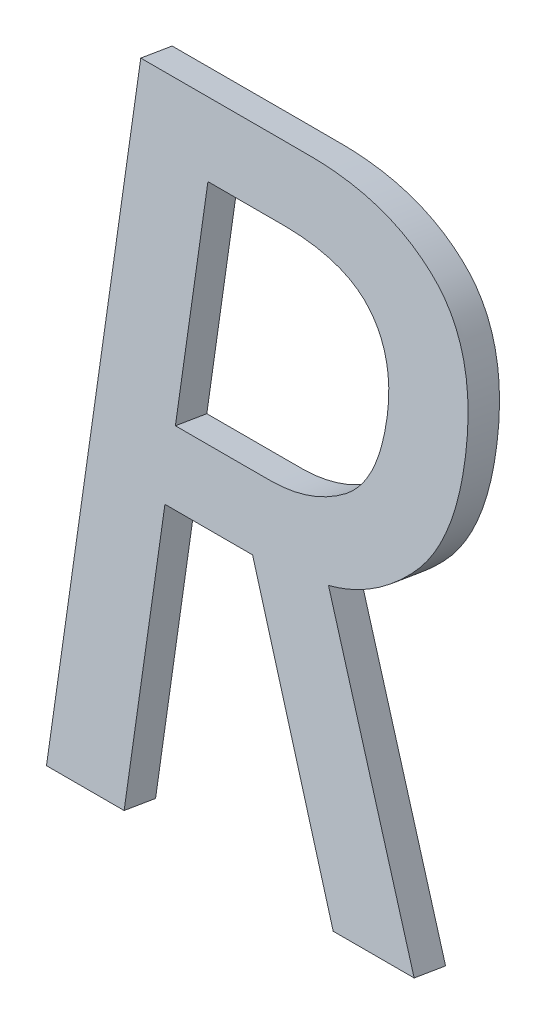
ISO-10303-21;
HEADER;
FILE_DESCRIPTION(('STEP AP214'),'2;1');
FILE_NAME('part.step','',(''),(''),'','','');
FILE_SCHEMA(('AUTOMOTIVE_DESIGN { 1 0 10303 214 1 1 1 1 }'));
ENDSEC;
DATA;
#1=APPLICATION_CONTEXT('core data for automotive mechanical design processes');
#2=APPLICATION_PROTOCOL_DEFINITION('international standard','automotive_design',2000,#1);
#3=PRODUCT_CONTEXT('',#1,'mechanical');
#4=PRODUCT('Part','Part','',(#3));
#5=PRODUCT_RELATED_PRODUCT_CATEGORY('part','',(#4));
#6=PRODUCT_DEFINITION_FORMATION('','',#4);
#7=PRODUCT_DEFINITION_CONTEXT('part definition',#1,'design');
#8=PRODUCT_DEFINITION('design','',#6,#7);
#9=PRODUCT_DEFINITION_SHAPE('','',#8);
#10=(LENGTH_UNIT() NAMED_UNIT(*) SI_UNIT(.MILLI.,.METRE.));
#11=(NAMED_UNIT(*) PLANE_ANGLE_UNIT() SI_UNIT($,.RADIAN.));
#12=(NAMED_UNIT(*) SI_UNIT($,.STERADIAN.) SOLID_ANGLE_UNIT());
#13=UNCERTAINTY_MEASURE_WITH_UNIT(LENGTH_MEASURE(1.E-05),#10,'distance_accuracy_value','');
#14=(GEOMETRIC_REPRESENTATION_CONTEXT(3) GLOBAL_UNCERTAINTY_ASSIGNED_CONTEXT((#13)) GLOBAL_UNIT_ASSIGNED_CONTEXT((#10,
#11,#12)) REPRESENTATION_CONTEXT('',''));
#15=CARTESIAN_POINT('',(0.,0.,0.));
#16=DIRECTION('',(0.,0.,1.));
#17=DIRECTION('',(1.,0.,0.));
#18=AXIS2_PLACEMENT_3D('',#15,#16,#17);
#19=CARTESIAN_POINT('',(1541.18631578947,1263.19417110488,1223.84235274767));
#20=CARTESIAN_POINT('',(1538.18902255639,1265.97752778099,1223.37845996831));
#21=CARTESIAN_POINT('',(1533.32586466165,1267.35947410269,1223.14813558136));
#22=CARTESIAN_POINT('',(1522.73939849624,1267.35947410269,1223.14813558136));
#23=CARTESIAN_POINT('',(1518.86210526315,1267.35947410269,1223.14813558136));
#24=CARTESIAN_POINT('',(1514.98481203008,1267.35947410269,1223.14813558136));
#25=B_SPLINE_CURVE_WITH_KNOTS('',3,(#19,#20,#21,#22,#23,#24),.UNSPECIFIED.,.F.,.F.,(4,2,4),(0.,
0.174245445472651,0.27494350370437),.UNSPECIFIED.);
#26=DIRECTION('',(0.,-0.164398987305355,-0.986393923832144));
#27=VECTOR('',#26,1.);
#28=SURFACE_OF_LINEAR_EXTRUSION('',#25,#27);
#29=CARTESIAN_POINT('',(1541.18631578947,1262.37217616836,1218.91038312851));
#30=CARTESIAN_POINT('',(1538.18902255639,1265.15553284446,1218.44649034915));
#31=CARTESIAN_POINT('',(1533.32586466165,1266.53747916617,1218.2161659622));
#32=CARTESIAN_POINT('',(1522.73939849624,1266.53747916617,1218.2161659622));
#33=CARTESIAN_POINT('',(1518.86210526315,1266.53747916617,1218.2161659622));
#34=CARTESIAN_POINT('',(1514.98481203008,1266.53747916617,1218.2161659622));
#35=B_SPLINE_CURVE_WITH_KNOTS('',3,(#29,#30,#31,#32,#33,#34),.UNSPECIFIED.,.F.,.F.,(4,2,4),(0.,
0.174245445472651,0.27494350370437),.UNSPECIFIED.);
#36=CARTESIAN_POINT('',(1541.18631578947,1262.37217616836,1218.91038312851));
#37=VERTEX_POINT('',#36);
#38=CARTESIAN_POINT('',(1514.98481203008,1266.53747916617,1218.2161659622));
#39=VERTEX_POINT('',#38);
#40=EDGE_CURVE('E112',#37,#39,#35,.T.);
#41=ORIENTED_EDGE('',*,*,#40,.F.);
#42=DIRECTION('',(0.,-0.164398987305355,-0.986393923832144));
#43=VECTOR('',#42,1.);
#44=CARTESIAN_POINT('',(1541.18631578947,1263.19417110488,1223.84235274767));
#45=LINE('',#44,#43);
#46=CARTESIAN_POINT('',(1541.18631578947,1263.19417110488,1223.84235274767));
#47=VERTEX_POINT('',#46);
#48=EDGE_CURVE('E102',#47,#37,#45,.T.);
#49=ORIENTED_EDGE('',*,*,#48,.F.);
#50=CARTESIAN_POINT('',(1514.98481203008,1267.35947410269,1223.14813558136));
#51=VERTEX_POINT('',#50);
#52=EDGE_CURVE('E111',#47,#51,#25,.T.);
#53=ORIENTED_EDGE('',*,*,#52,.T.);
#54=DIRECTION('',(0.,-0.164398987305355,-0.986393923832144));
#55=VECTOR('',#54,1.);
#56=CARTESIAN_POINT('',(1514.98481203008,1267.35947410269,1223.14813558136));
#57=LINE('',#56,#55);
#58=EDGE_CURVE('E121',#51,#39,#57,.T.);
#59=ORIENTED_EDGE('',*,*,#58,.T.);
#60=EDGE_LOOP('',(#41,#49,#53,#59));
#61=FACE_BOUND('',#60,.T.);
#62=ADVANCED_FACE('F17',(#61),#28,.T.);
#63=CARTESIAN_POINT('',(1514.98481203008,1267.35947410269,1223.14813558136));
#64=DIRECTION('',(1.,0.,0.));
#65=DIRECTION('',(0.,1.,0.));
#66=AXIS2_PLACEMENT_3D('',#63,#64,#65);
#67=PLANE('',#66);
#68=CARTESIAN_POINT('',(1514.98481203008,1266.53747916617,1218.2161659622));
#69=CARTESIAN_POINT('',(1514.98481203008,1256.32535000954,1219.91818748831));
#70=CARTESIAN_POINT('',(1514.98481203008,1246.11322085292,1221.62020901441));
#71=CARTESIAN_POINT('',(1514.98481203008,1235.9010916963,1223.32223054051));
#72=B_SPLINE_CURVE_WITH_KNOTS('',3,(#68,#69,#70,#71),.UNSPECIFIED.,.F.,.F.,(4,4),
(0.27494350370437,0.543823416990666),.UNSPECIFIED.);
#73=CARTESIAN_POINT('',(1514.98481203008,1235.9010916963,1223.32223054051));
#74=VERTEX_POINT('',#73);
#75=EDGE_CURVE('E117',#39,#74,#72,.T.);
#76=ORIENTED_EDGE('',*,*,#75,.F.);
#77=ORIENTED_EDGE('',*,*,#58,.F.);
#78=CARTESIAN_POINT('',(1514.98481203008,1267.35947410269,1223.14813558136));
#79=CARTESIAN_POINT('',(1514.98481203008,1257.14734494607,1224.85015710747));
#80=CARTESIAN_POINT('',(1514.98481203008,1246.93521578945,1226.55217863357));
#81=CARTESIAN_POINT('',(1514.98481203008,1236.72308663283,1228.25420015968));
#82=B_SPLINE_CURVE_WITH_KNOTS('',3,(#78,#79,#80,#81),.UNSPECIFIED.,.F.,.F.,(4,4),
(0.27494350370437,0.543823416990666),.UNSPECIFIED.);
#83=CARTESIAN_POINT('',(1514.98481203008,1236.72308663283,1228.25420015968));
#84=VERTEX_POINT('',#83);
#85=EDGE_CURVE('E391',#51,#84,#82,.T.);
#86=ORIENTED_EDGE('',*,*,#85,.T.);
#87=DIRECTION('',(0.,-0.164398987305355,-0.986393923832144));
#88=VECTOR('',#87,1.);
#89=CARTESIAN_POINT('',(1514.98481203008,1236.72308663283,1228.25420015968));
#90=LINE('',#89,#88);
#91=EDGE_CURVE('E381',#84,#74,#90,.T.);
#92=ORIENTED_EDGE('',*,*,#91,.T.);
#93=EDGE_LOOP('',(#76,#77,#86,#92));
#94=FACE_BOUND('',#93,.T.);
#95=ADVANCED_FACE('F146',(#94),#67,.T.);
#96=CARTESIAN_POINT('',(1547.7962406015,1188.45228553672,1236.29933367569));
#97=DIRECTION('',(-0.898271072600983,-0.433462704047867,0.0722437840079773));
#98=DIRECTION('',(0.434598307704038,-0.900624400591493,0.));
#99=AXIS2_PLACEMENT_3D('',#96,#97,#98);
#100=PLANE('',#99);
#101=CARTESIAN_POINT('',(1547.7962406015,1187.63029060019,1231.36736405653));
#102=CARTESIAN_POINT('',(1541.44436090226,1200.43762411682,1229.23280847043));
#103=CARTESIAN_POINT('',(1535.092481203,1213.24495763345,1227.09825288432));
#104=CARTESIAN_POINT('',(1528.74060150375,1226.05229115008,1224.96369729822));
#105=B_SPLINE_CURVE_WITH_KNOTS('',3,(#101,#102,#103,#104),.UNSPECIFIED.,.F.,.F.,(4,4),(0.,
0.120897159952057),.UNSPECIFIED.);
#106=CARTESIAN_POINT('',(1547.7962406015,1187.63029060019,1231.36736405653));
#107=VERTEX_POINT('',#106);
#108=CARTESIAN_POINT('',(1528.74060150375,1226.05229115008,1224.96369729822));
#109=VERTEX_POINT('',#108);
#110=EDGE_CURVE('E377',#107,#109,#105,.T.);
#111=ORIENTED_EDGE('',*,*,#110,.F.);
#112=DIRECTION('',(0.,-0.164398987305355,-0.986393923832144));
#113=VECTOR('',#112,1.);
#114=CARTESIAN_POINT('',(1547.7962406015,1188.45228553672,1236.29933367569));
#115=LINE('',#114,#113);
#116=CARTESIAN_POINT('',(1547.7962406015,1188.45228553672,1236.29933367569));
#117=VERTEX_POINT('',#116);
#118=EDGE_CURVE('E367',#117,#107,#115,.T.);
#119=ORIENTED_EDGE('',*,*,#118,.F.);
#120=CARTESIAN_POINT('',(1547.7962406015,1188.45228553672,1236.29933367569));
#121=CARTESIAN_POINT('',(1541.44436090226,1201.25961905335,1234.16477808959));
#122=CARTESIAN_POINT('',(1535.092481203,1214.06695256998,1232.03022250348));
#123=CARTESIAN_POINT('',(1528.74060150375,1226.8742860866,1229.89566691738));
#124=B_SPLINE_CURVE_WITH_KNOTS('',3,(#120,#121,#122,#123),.UNSPECIFIED.,.F.,.F.,(4,4),(0.,
0.120897159952057),.UNSPECIFIED.);
#125=CARTESIAN_POINT('',(1528.74060150375,1226.8742860866,1229.89566691738));
#126=VERTEX_POINT('',#125);
#127=EDGE_CURVE('E363',#117,#126,#124,.T.);
#128=ORIENTED_EDGE('',*,*,#127,.T.);
#129=DIRECTION('',(0.,-0.164398987305355,-0.986393923832144));
#130=VECTOR('',#129,1.);
#131=CARTESIAN_POINT('',(1528.74060150375,1226.8742860866,1229.89566691738));
#132=LINE('',#131,#130);
#133=EDGE_CURVE('E353',#126,#109,#132,.T.);
#134=ORIENTED_EDGE('',*,*,#133,.T.);
#135=EDGE_LOOP('',(#111,#119,#128,#134));
#136=FACE_BOUND('',#135,.T.);
#137=ADVANCED_FACE('F149',(#136),#100,.T.);
#138=CARTESIAN_POINT('',(1528.74060150375,1226.8742860866,1229.89566691738));
#139=DIRECTION('',(0.,-0.986393923832144,0.164398987305355));
#140=DIRECTION('',(0.,-0.164398987305355,-0.986393923832144));
#141=AXIS2_PLACEMENT_3D('',#138,#139,#140);
#142=PLANE('',#141);
#143=CARTESIAN_POINT('',(1528.74060150375,1226.05229115008,1224.96369729822));
#144=CARTESIAN_POINT('',(1524.15533834586,1226.05229115008,1224.96369729822));
#145=CARTESIAN_POINT('',(1519.57007518797,1226.05229115008,1224.96369729822));
#146=CARTESIAN_POINT('',(1514.98481203008,1226.05229115008,1224.96369729822));
#147=B_SPLINE_CURVE_WITH_KNOTS('',3,(#143,#144,#145,#146),.UNSPECIFIED.,.F.,.F.,(4,4),
(0.120897159952057,0.1592484032606),.UNSPECIFIED.);
#148=CARTESIAN_POINT('',(1514.98481203008,1226.05229115008,1224.96369729822));
#149=VERTEX_POINT('',#148);
#150=EDGE_CURVE('E342',#109,#149,#147,.T.);
#151=ORIENTED_EDGE('',*,*,#150,.F.);
#152=ORIENTED_EDGE('',*,*,#133,.F.);
#153=CARTESIAN_POINT('',(1528.74060150375,1226.8742860866,1229.89566691738));
#154=CARTESIAN_POINT('',(1524.15533834586,1226.8742860866,1229.89566691738));
#155=CARTESIAN_POINT('',(1519.57007518797,1226.8742860866,1229.89566691738));
#156=CARTESIAN_POINT('',(1514.98481203008,1226.8742860866,1229.89566691738));
#157=B_SPLINE_CURVE_WITH_KNOTS('',3,(#153,#154,#155,#156),.UNSPECIFIED.,.F.,.F.,(4,4),
(0.120897159952057,0.1592484032606),.UNSPECIFIED.);
#158=CARTESIAN_POINT('',(1514.98481203008,1226.8742860866,1229.89566691738));
#159=VERTEX_POINT('',#158);
#160=EDGE_CURVE('E338',#126,#159,#157,.T.);
#161=ORIENTED_EDGE('',*,*,#160,.T.);
#162=DIRECTION('',(0.,-0.164398987305355,-0.986393923832144));
#163=VECTOR('',#162,1.);
#164=CARTESIAN_POINT('',(1514.98481203008,1226.8742860866,1229.89566691738));
#165=LINE('',#164,#163);
#166=EDGE_CURVE('E328',#159,#149,#165,.T.);
#167=ORIENTED_EDGE('',*,*,#166,.T.);
#168=EDGE_LOOP('',(#151,#152,#161,#167));
#169=FACE_BOUND('',#168,.T.);
#170=ADVANCED_FACE('F153',(#169),#142,.T.);
#171=CARTESIAN_POINT('',(1514.98481203008,1226.8742860866,1229.89566691738));
#172=DIRECTION('',(1.,0.,0.));
#173=DIRECTION('',(0.,0.,-1.));
#174=AXIS2_PLACEMENT_3D('',#171,#172,#173);
#175=PLANE('',#174);
#176=CARTESIAN_POINT('',(1514.98481203008,1226.05229115008,1224.96369729822));
#177=CARTESIAN_POINT('',(1514.98481203008,1213.24495763345,1227.09825288432));
#178=CARTESIAN_POINT('',(1514.98481203008,1200.43762411682,1229.23280847043));
#179=CARTESIAN_POINT('',(1514.98481203008,1187.63029060019,1231.36736405653));
#180=B_SPLINE_CURVE_WITH_KNOTS('',3,(#176,#177,#178,#179),.UNSPECIFIED.,.F.,.F.,(4,4),
(0.1592484032606,0.267846824805147),.UNSPECIFIED.);
#181=CARTESIAN_POINT('',(1514.98481203008,1187.63029060019,1231.36736405653));
#182=VERTEX_POINT('',#181);
#183=EDGE_CURVE('E317',#149,#182,#180,.T.);
#184=ORIENTED_EDGE('',*,*,#183,.F.);
#185=ORIENTED_EDGE('',*,*,#166,.F.);
#186=CARTESIAN_POINT('',(1514.98481203008,1226.8742860866,1229.89566691738));
#187=CARTESIAN_POINT('',(1514.98481203008,1214.06695256998,1232.03022250348));
#188=CARTESIAN_POINT('',(1514.98481203008,1201.25961905335,1234.16477808959));
#189=CARTESIAN_POINT('',(1514.98481203008,1188.45228553672,1236.29933367569));
#190=B_SPLINE_CURVE_WITH_KNOTS('',3,(#186,#187,#188,#189),.UNSPECIFIED.,.F.,.F.,(4,4),
(0.1592484032606,0.267846824805147),.UNSPECIFIED.);
#191=CARTESIAN_POINT('',(1514.98481203008,1188.45228553672,1236.29933367569));
#192=VERTEX_POINT('',#191);
#193=EDGE_CURVE('E313',#159,#192,#190,.T.);
#194=ORIENTED_EDGE('',*,*,#193,.T.);
#195=DIRECTION('',(0.,-0.164398987305355,-0.986393923832144));
#196=VECTOR('',#195,1.);
#197=CARTESIAN_POINT('',(1514.98481203008,1188.45228553672,1236.29933367569));
#198=LINE('',#197,#196);
#199=EDGE_CURVE('E303',#192,#182,#198,.T.);
#200=ORIENTED_EDGE('',*,*,#199,.T.);
#201=EDGE_LOOP('',(#184,#185,#194,#200));
#202=FACE_BOUND('',#201,.T.);
#203=ADVANCED_FACE('F157',(#202),#175,.T.);
#204=CARTESIAN_POINT('',(1514.98481203008,1188.45228553672,1236.29933367569));
#205=DIRECTION('',(0.,-0.986393923832144,0.164398987305355));
#206=DIRECTION('',(0.,-0.164398987305355,-0.986393923832144));
#207=AXIS2_PLACEMENT_3D('',#204,#205,#206);
#208=PLANE('',#207);
#209=CARTESIAN_POINT('',(1514.98481203008,1187.63029060019,1231.36736405653));
#210=CARTESIAN_POINT('',(1510.9222556391,1187.63029060019,1231.36736405653));
#211=CARTESIAN_POINT('',(1506.85969924812,1187.63029060019,1231.36736405653));
#212=CARTESIAN_POINT('',(1502.79714285714,1187.63029060019,1231.36736405653));
#213=B_SPLINE_CURVE_WITH_KNOTS('',3,(#209,#210,#211,#212),.UNSPECIFIED.,.F.,.F.,(4,4),
(0.267846824805147,0.301826137058316),.UNSPECIFIED.);
#214=CARTESIAN_POINT('',(1502.79714285714,1187.63029060019,1231.36736405653));
#215=VERTEX_POINT('',#214);
#216=EDGE_CURVE('E292',#182,#215,#213,.T.);
#217=ORIENTED_EDGE('',*,*,#216,.F.);
#218=ORIENTED_EDGE('',*,*,#199,.F.);
#219=CARTESIAN_POINT('',(1514.98481203008,1188.45228553672,1236.29933367569));
#220=CARTESIAN_POINT('',(1510.9222556391,1188.45228553672,1236.29933367569));
#221=CARTESIAN_POINT('',(1506.85969924812,1188.45228553672,1236.29933367569));
#222=CARTESIAN_POINT('',(1502.79714285714,1188.45228553672,1236.29933367569));
#223=B_SPLINE_CURVE_WITH_KNOTS('',3,(#219,#220,#221,#222),.UNSPECIFIED.,.F.,.F.,(4,4),
(0.267846824805147,0.301826137058316),.UNSPECIFIED.);
#224=CARTESIAN_POINT('',(1502.79714285714,1188.45228553672,1236.29933367569));
#225=VERTEX_POINT('',#224);
#226=EDGE_CURVE('E288',#192,#225,#223,.T.);
#227=ORIENTED_EDGE('',*,*,#226,.T.);
#228=DIRECTION('',(0.,-0.164398987305355,-0.986393923832144));
#229=VECTOR('',#228,1.);
#230=CARTESIAN_POINT('',(1502.79714285714,1188.45228553672,1236.29933367569));
#231=LINE('',#230,#229);
#232=EDGE_CURVE('E278',#225,#215,#231,.T.);
#233=ORIENTED_EDGE('',*,*,#232,.T.);
#234=EDGE_LOOP('',(#217,#218,#227,#233));
#235=FACE_BOUND('',#234,.T.);
#236=ADVANCED_FACE('F161',(#235),#208,.T.);
#237=CARTESIAN_POINT('',(1502.79714285714,1188.45228553672,1236.29933367569));
#238=DIRECTION('',(-1.,0.,0.));
#239=DIRECTION('',(0.,-1.,0.));
#240=AXIS2_PLACEMENT_3D('',#237,#238,#239);
#241=PLANE('',#240);
#242=CARTESIAN_POINT('',(1502.79714285714,1187.63029060019,1231.36736405653));
#243=CARTESIAN_POINT('',(1502.79714285714,1217.22210831516,1226.43539443737));
#244=CARTESIAN_POINT('',(1502.79714285714,1246.81392603012,1221.50342481821));
#245=CARTESIAN_POINT('',(1502.79714285714,1276.40574374509,1216.57145519905));
#246=B_SPLINE_CURVE_WITH_KNOTS('',3,(#242,#243,#244,#245),.UNSPECIFIED.,.F.,.F.,(4,4),
(0.301826137058316,0.552746806088042),.UNSPECIFIED.);
#247=CARTESIAN_POINT('',(1502.79714285714,1276.40574374509,1216.57145519905));
#248=VERTEX_POINT('',#247);
#249=EDGE_CURVE('E267',#215,#248,#246,.T.);
#250=ORIENTED_EDGE('',*,*,#249,.F.);
#251=ORIENTED_EDGE('',*,*,#232,.F.);
#252=CARTESIAN_POINT('',(1502.79714285714,1188.45228553672,1236.29933367569));
#253=CARTESIAN_POINT('',(1502.79714285714,1218.04410325169,1231.36736405653));
#254=CARTESIAN_POINT('',(1502.79714285714,1247.63592096665,1226.43539443737));
#255=CARTESIAN_POINT('',(1502.79714285714,1277.22773868161,1221.50342481821));
#256=B_SPLINE_CURVE_WITH_KNOTS('',3,(#252,#253,#254,#255),.UNSPECIFIED.,.F.,.F.,(4,4),
(0.301826137058316,0.552746806088042),.UNSPECIFIED.);
#257=CARTESIAN_POINT('',(1502.79714285714,1277.22773868161,1221.50342481821));
#258=VERTEX_POINT('',#257);
#259=EDGE_CURVE('E263',#225,#258,#256,.T.);
#260=ORIENTED_EDGE('',*,*,#259,.T.);
#261=DIRECTION('',(0.,-0.164398987305355,-0.986393923832144));
#262=VECTOR('',#261,1.);
#263=CARTESIAN_POINT('',(1502.79714285714,1277.22773868161,1221.50342481821));
#264=LINE('',#263,#262);
#265=EDGE_CURVE('E253',#258,#248,#264,.T.);
#266=ORIENTED_EDGE('',*,*,#265,.T.);
#267=EDGE_LOOP('',(#250,#251,#260,#266));
#268=FACE_BOUND('',#267,.T.);
#269=ADVANCED_FACE('F165',(#268),#241,.T.);
#270=CARTESIAN_POINT('',(1502.79714285714,1277.22773868161,1221.50342481821));
#271=CARTESIAN_POINT('',(1511.62360902256,1277.22773868161,1221.50342481821));
#272=CARTESIAN_POINT('',(1520.45009922032,1277.24805554306,1221.50003867464));
#273=CARTESIAN_POINT('',(1537.732481203,1277.20827464891,1221.50666882366));
#274=CARTESIAN_POINT('',(1544.62980290825,1275.23525340589,1221.8355056975));
#275=CARTESIAN_POINT('',(1555.22,1267.26215393919,1223.16435560861));
#276=CARTESIAN_POINT('',(1557.86,1260.78063105008,1224.24460942347));
#277=CARTESIAN_POINT('',(1557.86,1244.85905230144,1226.89820588157));
#278=CARTESIAN_POINT('',(1556.09338345864,1239.50644330893,1227.79030738032));
#279=CARTESIAN_POINT('',(1549.02691729323,1231.87654249052,1229.06195751673));
#280=CARTESIAN_POINT('',(1544.97759398496,1229.46300243571,1229.46421419253));
#281=CARTESIAN_POINT('',(1540.39233082707,1228.43140870261,1229.63614648138));
#282=B_SPLINE_CURVE_WITH_KNOTS('',3,(#270,#271,#272,#273,#274,#275,#276,#277,#278,#279,#280,
#281),.UNSPECIFIED.,.F.,.F.,(4,2,2,2,2,4),(0.552746806088042,0.613491158641943,
0.671685681832197,0.729984730001771,0.774907806080491,0.819830882159211),.UNSPECIFIED.);
#283=DIRECTION('',(0.,-0.164398987305355,-0.986393923832144));
#284=VECTOR('',#283,1.);
#285=SURFACE_OF_LINEAR_EXTRUSION('',#282,#284);
#286=CARTESIAN_POINT('',(1502.79714285714,1276.40574374509,1216.57145519905));
#287=CARTESIAN_POINT('',(1511.62360902256,1276.40574374509,1216.57145519905));
#288=CARTESIAN_POINT('',(1520.45009922032,1276.42606060653,1216.56806905548));
#289=CARTESIAN_POINT('',(1537.732481203,1276.38627971239,1216.5746992045));
#290=CARTESIAN_POINT('',(1544.62980290825,1274.41325846937,1216.90353607834));
#291=CARTESIAN_POINT('',(1555.22,1266.44015900267,1218.23238598945));
#292=CARTESIAN_POINT('',(1557.86,1259.95863611355,1219.31263980431));
#293=CARTESIAN_POINT('',(1557.86,1244.03705736492,1221.96623626241));
#294=CARTESIAN_POINT('',(1556.09338345864,1238.68444837241,1222.85833776116));
#295=CARTESIAN_POINT('',(1549.02691729323,1231.05454755399,1224.12998789757));
#296=CARTESIAN_POINT('',(1544.97759398496,1228.64100749918,1224.53224457337));
#297=CARTESIAN_POINT('',(1540.39233082707,1227.60941376608,1224.70417686222));
#298=B_SPLINE_CURVE_WITH_KNOTS('',3,(#286,#287,#288,#289,#290,#291,#292,#293,#294,#295,#296,
#297),.UNSPECIFIED.,.F.,.F.,(4,2,2,2,2,4),(0.552746806088042,0.613491158641943,
0.671685681832197,0.729984730001771,0.774907806080491,0.819830882159211),.UNSPECIFIED.);
#299=CARTESIAN_POINT('',(1540.39233082707,1227.60941376608,1224.70417686222));
#300=VERTEX_POINT('',#299);
#301=EDGE_CURVE('E249',#248,#300,#298,.T.);
#302=ORIENTED_EDGE('',*,*,#301,.F.);
#303=ORIENTED_EDGE('',*,*,#265,.F.);
#304=CARTESIAN_POINT('',(1540.39233082707,1228.43140870261,1229.63614648138));
#305=VERTEX_POINT('',#304);
#306=EDGE_CURVE('E245',#258,#305,#282,.T.);
#307=ORIENTED_EDGE('',*,*,#306,.T.);
#308=DIRECTION('',(0.,-0.164398987305355,-0.986393923832144));
#309=VECTOR('',#308,1.);
#310=CARTESIAN_POINT('',(1540.39233082707,1228.43140870261,1229.63614648138));
#311=LINE('',#310,#309);
#312=EDGE_CURVE('E235',#305,#300,#311,.T.);
#313=ORIENTED_EDGE('',*,*,#312,.T.);
#314=EDGE_LOOP('',(#302,#303,#307,#313));
#315=FACE_BOUND('',#314,.T.);
#316=ADVANCED_FACE('F169',(#315),#285,.T.);
#317=CARTESIAN_POINT('',(1540.39233082707,1228.43140870261,1229.63614648138));
#318=DIRECTION('',(0.895816381359564,0.43837748733757,-0.073062914556261));
#319=DIRECTION('',(-0.439552263866599,0.898217015720448,0.));
#320=AXIS2_PLACEMENT_3D('',#317,#318,#319);
#321=PLANE('',#320);
#322=CARTESIAN_POINT('',(1540.39233082707,1227.60941376608,1224.70417686222));
#323=CARTESIAN_POINT('',(1547.09488721804,1214.28303937745,1226.92523926032));
#324=CARTESIAN_POINT('',(1553.79744360902,1200.95666498882,1229.14630165843));
#325=CARTESIAN_POINT('',(1560.5,1187.63029060019,1231.36736405653));
#326=B_SPLINE_CURVE_WITH_KNOTS('',3,(#322,#323,#324,#325),.UNSPECIFIED.,.F.,.F.,(4,4),
(0.819830882159211,0.960502126648434),.UNSPECIFIED.);
#327=CARTESIAN_POINT('',(1560.5,1187.63029060019,1231.36736405653));
#328=VERTEX_POINT('',#327);
#329=EDGE_CURVE('E224',#300,#328,#326,.T.);
#330=ORIENTED_EDGE('',*,*,#329,.F.);
#331=ORIENTED_EDGE('',*,*,#312,.F.);
#332=CARTESIAN_POINT('',(1540.39233082707,1228.43140870261,1229.63614648138));
#333=CARTESIAN_POINT('',(1547.09488721804,1215.10503431398,1231.85720887948));
#334=CARTESIAN_POINT('',(1553.79744360902,1201.77865992535,1234.07827127759));
#335=CARTESIAN_POINT('',(1560.5,1188.45228553672,1236.29933367569));
#336=B_SPLINE_CURVE_WITH_KNOTS('',3,(#332,#333,#334,#335),.UNSPECIFIED.,.F.,.F.,(4,4),
(0.819830882159211,0.960502126648434),.UNSPECIFIED.);
#337=CARTESIAN_POINT('',(1560.5,1188.45228553672,1236.29933367569));
#338=VERTEX_POINT('',#337);
#339=EDGE_CURVE('E221',#305,#338,#336,.T.);
#340=ORIENTED_EDGE('',*,*,#339,.T.);
#341=DIRECTION('',(0.,-0.164398987305355,-0.986393923832144));
#342=VECTOR('',#341,1.);
#343=CARTESIAN_POINT('',(1560.5,1188.45228553672,1236.29933367569));
#344=LINE('',#343,#342);
#345=EDGE_CURVE('E39',#338,#328,#344,.T.);
#346=ORIENTED_EDGE('',*,*,#345,.T.);
#347=EDGE_LOOP('',(#330,#331,#340,#346));
#348=FACE_BOUND('',#347,.T.);
#349=ADVANCED_FACE('F173',(#348),#321,.T.);
#350=CARTESIAN_POINT('',(1560.5,1188.45228553672,1236.29933367569));
#351=DIRECTION('',(0.,-0.986393923832144,0.164398987305355));
#352=DIRECTION('',(0.,-0.164398987305355,-0.986393923832144));
#353=AXIS2_PLACEMENT_3D('',#350,#351,#352);
#354=PLANE('',#353);
#355=CARTESIAN_POINT('',(1560.5,1187.63029060019,1231.36736405653));
#356=CARTESIAN_POINT('',(1556.26541353383,1187.63029060019,1231.36736405653));
#357=CARTESIAN_POINT('',(1552.03082706767,1187.63029060019,1231.36736405653));
#358=CARTESIAN_POINT('',(1547.7962406015,1187.63029060019,1231.36736405653));
#359=B_SPLINE_CURVE_WITH_KNOTS('',3,(#355,#356,#357,#358),.UNSPECIFIED.,.F.,.F.,(4,4),
(0.960502126648434,1.),.UNSPECIFIED.);
#360=EDGE_CURVE('E201',#328,#107,#359,.T.);
#361=ORIENTED_EDGE('',*,*,#360,.F.);
#362=ORIENTED_EDGE('',*,*,#345,.F.);
#363=CARTESIAN_POINT('',(1560.5,1188.45228553672,1236.29933367569));
#364=CARTESIAN_POINT('',(1556.26541353383,1188.45228553672,1236.29933367569));
#365=CARTESIAN_POINT('',(1552.03082706767,1188.45228553672,1236.29933367569));
#366=CARTESIAN_POINT('',(1547.7962406015,1188.45228553672,1236.29933367569));
#367=B_SPLINE_CURVE_WITH_KNOTS('',3,(#363,#364,#365,#366),.UNSPECIFIED.,.F.,.F.,(4,4),
(0.960502126648434,1.),.UNSPECIFIED.);
#368=EDGE_CURVE('E119',#338,#117,#367,.T.);
#369=ORIENTED_EDGE('',*,*,#368,.T.);
#370=ORIENTED_EDGE('',*,*,#118,.T.);
#371=EDGE_LOOP('',(#361,#362,#369,#370));
#372=FACE_BOUND('',#371,.T.);
#373=ADVANCED_FACE('F177',(#372),#354,.T.);
#374=CARTESIAN_POINT('',(1514.98481203008,1236.72308663283,1228.25420015968));
#375=CARTESIAN_POINT('',(1519.92075187969,1236.72308663283,1228.25420015968));
#376=CARTESIAN_POINT('',(1524.85669172932,1236.72308663283,1228.25420015968));
#377=CARTESIAN_POINT('',(1534.04045112782,1236.72308663283,1228.25420015968));
#378=CARTESIAN_POINT('',(1537.72312052156,1237.86486726774,1228.06390338719));
#379=CARTESIAN_POINT('',(1544.08436090225,1242.34819208314,1227.31668258462));
#380=CARTESIAN_POINT('',(1545.67233082707,1246.24099862315,1226.66788149462));
#381=CARTESIAN_POINT('',(1545.67233082707,1256.63479208497,1224.93558258432));
#382=CARTESIAN_POINT('',(1544.18360902256,1260.43027846148,1224.30300152157));
#383=CARTESIAN_POINT('',(1541.18631578947,1263.19417110488,1223.84235274767));
#384=B_SPLINE_CURVE_WITH_KNOTS('',3,(#374,#375,#376,#377,#378,#379,#380,#381,#382,#383),
.UNSPECIFIED.,.F.,.F.,(4,2,2,2,4),(0.543823416990666,0.675349907328564,0.7885402649652,
0.901397988719729,1.),.UNSPECIFIED.);
#385=DIRECTION('',(0.,-0.164398987305355,-0.986393923832144));
#386=VECTOR('',#385,1.);
#387=SURFACE_OF_LINEAR_EXTRUSION('',#384,#386);
#388=CARTESIAN_POINT('',(1514.98481203008,1235.9010916963,1223.32223054051));
#389=CARTESIAN_POINT('',(1519.92075187969,1235.9010916963,1223.32223054051));
#390=CARTESIAN_POINT('',(1524.85669172932,1235.9010916963,1223.32223054051));
#391=CARTESIAN_POINT('',(1534.04045112782,1235.9010916963,1223.32223054051));
#392=CARTESIAN_POINT('',(1537.72312052156,1237.04287233122,1223.13193376803));
#393=CARTESIAN_POINT('',(1544.08436090225,1241.52619714661,1222.38471296546));
#394=CARTESIAN_POINT('',(1545.67233082707,1245.41900368662,1221.73591187546));
#395=CARTESIAN_POINT('',(1545.67233082707,1255.81279714844,1220.00361296516));
#396=CARTESIAN_POINT('',(1544.18360902256,1259.60828352495,1219.37103190241));
#397=CARTESIAN_POINT('',(1541.18631578947,1262.37217616836,1218.91038312851));
#398=B_SPLINE_CURVE_WITH_KNOTS('',3,(#388,#389,#390,#391,#392,#393,#394,#395,#396,#397),
.UNSPECIFIED.,.F.,.F.,(4,2,2,2,4),(0.543823416990666,0.675349907328564,0.7885402649652,
0.901397988719729,1.),.UNSPECIFIED.);
#399=EDGE_CURVE('E30',#74,#37,#398,.T.);
#400=ORIENTED_EDGE('',*,*,#399,.F.);
#401=ORIENTED_EDGE('',*,*,#91,.F.);
#402=EDGE_CURVE('E11',#84,#47,#384,.T.);
#403=ORIENTED_EDGE('',*,*,#402,.T.);
#404=ORIENTED_EDGE('',*,*,#48,.T.);
#405=EDGE_LOOP('',(#400,#401,#403,#404));
#406=FACE_BOUND('',#405,.T.);
#407=ADVANCED_FACE('F106',(#406),#387,.T.);
#408=CARTESIAN_POINT('',(1553.4024276824,1267.78458928921,1223.07728305028));
#409=DIRECTION('',(0.,-0.16439898729312,-0.986393923834183));
#410=DIRECTION('',(0.,0.986393923834183,-0.16439898729312));
#411=AXIS2_PLACEMENT_3D('',#408,#409,#410);
#412=PLANE('',#411);
#413=ORIENTED_EDGE('',*,*,#127,.F.);
#414=ORIENTED_EDGE('',*,*,#368,.F.);
#415=ORIENTED_EDGE('',*,*,#339,.F.);
#416=ORIENTED_EDGE('',*,*,#306,.F.);
#417=ORIENTED_EDGE('',*,*,#259,.F.);
#418=ORIENTED_EDGE('',*,*,#226,.F.);
#419=ORIENTED_EDGE('',*,*,#193,.F.);
#420=ORIENTED_EDGE('',*,*,#160,.F.);
#421=EDGE_LOOP('',(#413,#414,#415,#416,#417,#418,#419,#420));
#422=FACE_BOUND('',#421,.T.);
#423=ORIENTED_EDGE('',*,*,#52,.F.);
#424=ORIENTED_EDGE('',*,*,#402,.F.);
#425=ORIENTED_EDGE('',*,*,#85,.F.);
#426=EDGE_LOOP('',(#423,#424,#425));
#427=FACE_BOUND('',#426,.T.);
#428=ADVANCED_FACE('F182',(#422,#427),#412,.F.);
#429=CARTESIAN_POINT('',(1553.4024276824,1266.96259435269,1218.14531343112));
#430=DIRECTION('',(0.,-0.16439898729312,-0.986393923834183));
#431=DIRECTION('',(0.,0.986393923834183,-0.16439898729312));
#432=AXIS2_PLACEMENT_3D('',#429,#430,#431);
#433=PLANE('',#432);
#434=ORIENTED_EDGE('',*,*,#110,.T.);
#435=ORIENTED_EDGE('',*,*,#150,.T.);
#436=ORIENTED_EDGE('',*,*,#183,.T.);
#437=ORIENTED_EDGE('',*,*,#216,.T.);
#438=ORIENTED_EDGE('',*,*,#249,.T.);
#439=ORIENTED_EDGE('',*,*,#301,.T.);
#440=ORIENTED_EDGE('',*,*,#329,.T.);
#441=ORIENTED_EDGE('',*,*,#360,.T.);
#442=EDGE_LOOP('',(#434,#435,#436,#437,#438,#439,#440,#441));
#443=FACE_BOUND('',#442,.T.);
#444=ORIENTED_EDGE('',*,*,#40,.T.);
#445=ORIENTED_EDGE('',*,*,#75,.T.);
#446=ORIENTED_EDGE('',*,*,#399,.T.);
#447=EDGE_LOOP('',(#444,#445,#446));
#448=FACE_BOUND('',#447,.T.);
#449=ADVANCED_FACE('F19',(#443,#448),#433,.T.);
#450=CLOSED_SHELL('',(#62,#95,#137,#170,#203,#236,#269,#316,#349,#373,#407,#428,#449));
#451=MANIFOLD_SOLID_BREP('B1',#450);
#452=ADVANCED_BREP_SHAPE_REPRESENTATION('',(#18,#451),#14);
#453=SHAPE_DEFINITION_REPRESENTATION(#9,#452);
ENDSEC;
END-ISO-10303-21;
